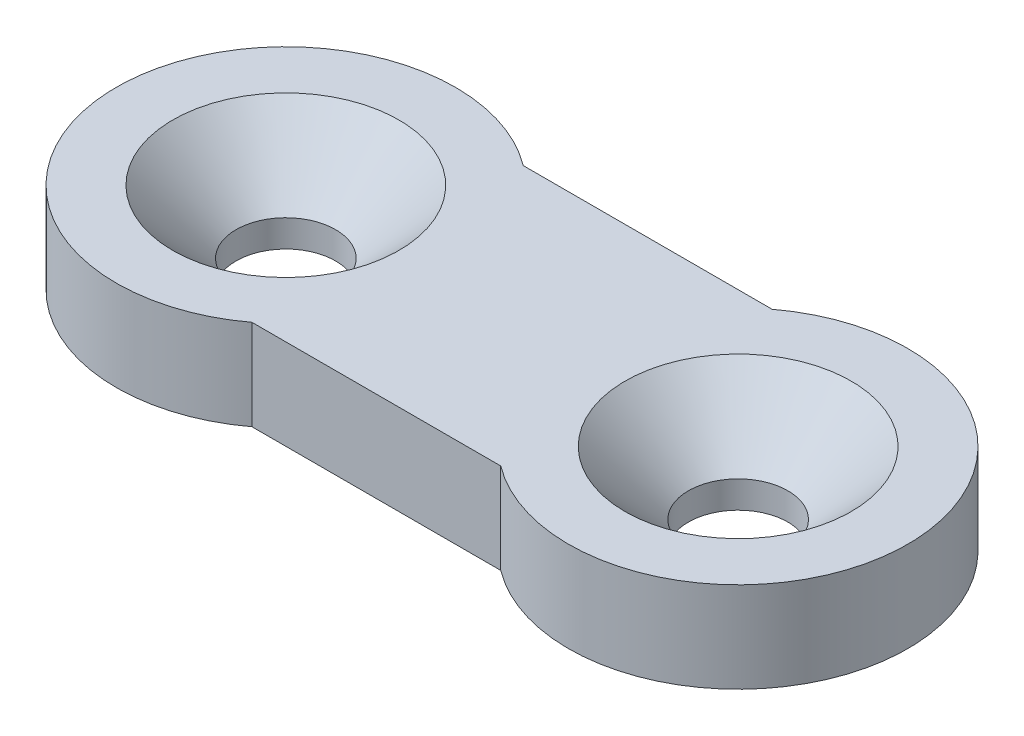
ISO-10303-21;
HEADER;
FILE_DESCRIPTION(('STEP AP214'),'2;1');
FILE_NAME('part.step','',(''),(''),'','','');
FILE_SCHEMA(('AUTOMOTIVE_DESIGN { 1 0 10303 214 1 1 1 1 }'));
ENDSEC;
DATA;
#1=APPLICATION_CONTEXT('core data for automotive mechanical design processes');
#2=APPLICATION_PROTOCOL_DEFINITION('international standard','automotive_design',2000,#1);
#3=PRODUCT_CONTEXT('',#1,'mechanical');
#4=PRODUCT('Part','Part','',(#3));
#5=PRODUCT_RELATED_PRODUCT_CATEGORY('part','',(#4));
#6=PRODUCT_DEFINITION_FORMATION('','',#4);
#7=PRODUCT_DEFINITION_CONTEXT('part definition',#1,'design');
#8=PRODUCT_DEFINITION('design','',#6,#7);
#9=PRODUCT_DEFINITION_SHAPE('','',#8);
#10=(LENGTH_UNIT() NAMED_UNIT(*) SI_UNIT(.MILLI.,.METRE.));
#11=(NAMED_UNIT(*) PLANE_ANGLE_UNIT() SI_UNIT($,.RADIAN.));
#12=(NAMED_UNIT(*) SI_UNIT($,.STERADIAN.) SOLID_ANGLE_UNIT());
#13=UNCERTAINTY_MEASURE_WITH_UNIT(LENGTH_MEASURE(1.E-05),#10,'distance_accuracy_value','');
#14=(GEOMETRIC_REPRESENTATION_CONTEXT(3) GLOBAL_UNCERTAINTY_ASSIGNED_CONTEXT((#13)) GLOBAL_UNIT_ASSIGNED_CONTEXT((#10,
#11,#12)) REPRESENTATION_CONTEXT('',''));
#15=CARTESIAN_POINT('',(0.,0.,0.));
#16=DIRECTION('',(0.,0.,1.));
#17=DIRECTION('',(1.,0.,0.));
#18=AXIS2_PLACEMENT_3D('',#15,#16,#17);
#19=CARTESIAN_POINT('',(-5.,2.,0.));
#20=DIRECTION('',(0.,1.,0.));
#21=DIRECTION('',(0.,0.,1.));
#22=AXIS2_PLACEMENT_3D('',#19,#20,#21);
#23=PLANE('',#22);
#24=CARTESIAN_POINT('',(5.,2.,0.));
#25=DIRECTION('',(0.,1.,0.));
#26=DIRECTION('',(0.,0.,1.));
#27=AXIS2_PLACEMENT_3D('',#24,#25,#26);
#28=CIRCLE('',#27,2.50000000000001);
#29=CARTESIAN_POINT('',(5.,2.,2.50000000000001));
#30=VERTEX_POINT('',#29);
#31=EDGE_CURVE('E57',#30,#30,#28,.F.);
#32=ORIENTED_EDGE('',*,*,#31,.T.);
#33=EDGE_LOOP('',(#32));
#34=FACE_BOUND('',#33,.T.);
#35=CARTESIAN_POINT('',(-5.,2.,0.));
#36=DIRECTION('',(0.,1.,0.));
#37=DIRECTION('',(0.,0.,1.));
#38=AXIS2_PLACEMENT_3D('',#35,#36,#37);
#39=CIRCLE('',#38,2.50000000000001);
#40=CARTESIAN_POINT('',(-5.,2.,2.50000000000001));
#41=VERTEX_POINT('',#40);
#42=EDGE_CURVE('E150',#41,#41,#39,.F.);
#43=ORIENTED_EDGE('',*,*,#42,.T.);
#44=EDGE_LOOP('',(#43));
#45=FACE_BOUND('',#44,.T.);
#46=DIRECTION('',(1.,0.,0.));
#47=VECTOR('',#46,1.);
#48=CARTESIAN_POINT('',(-5.,2.,3.));
#49=LINE('',#48,#47);
#50=CARTESIAN_POINT('',(-2.75,2.,3.));
#51=VERTEX_POINT('',#50);
#52=CARTESIAN_POINT('',(2.75,2.,3.));
#53=VERTEX_POINT('',#52);
#54=EDGE_CURVE('E100',#51,#53,#49,.T.);
#55=ORIENTED_EDGE('',*,*,#54,.T.);
#56=CARTESIAN_POINT('',(5.,2.,0.));
#57=DIRECTION('',(0.,1.,0.));
#58=DIRECTION('',(0.,0.,1.));
#59=AXIS2_PLACEMENT_3D('',#56,#57,#58);
#60=CIRCLE('',#59,3.75);
#61=CARTESIAN_POINT('',(2.75,2.,-3.));
#62=VERTEX_POINT('',#61);
#63=EDGE_CURVE('E115',#53,#62,#60,.T.);
#64=ORIENTED_EDGE('',*,*,#63,.T.);
#65=DIRECTION('',(-1.,0.,0.));
#66=VECTOR('',#65,1.);
#67=CARTESIAN_POINT('',(-5.,2.,-3.));
#68=LINE('',#67,#66);
#69=CARTESIAN_POINT('',(-2.75,2.,-3.));
#70=VERTEX_POINT('',#69);
#71=EDGE_CURVE('E105',#62,#70,#68,.T.);
#72=ORIENTED_EDGE('',*,*,#71,.T.);
#73=CARTESIAN_POINT('',(-5.,2.,0.));
#74=DIRECTION('',(0.,1.,0.));
#75=DIRECTION('',(0.,0.,1.));
#76=AXIS2_PLACEMENT_3D('',#73,#74,#75);
#77=CIRCLE('',#76,3.75);
#78=EDGE_CURVE('E119',#70,#51,#77,.T.);
#79=ORIENTED_EDGE('',*,*,#78,.T.);
#80=EDGE_LOOP('',(#55,#64,#72,#79));
#81=FACE_BOUND('',#80,.T.);
#82=ADVANCED_FACE('F47',(#34,#45,#81),#23,.T.);
#83=CARTESIAN_POINT('',(-5.,0.,0.));
#84=DIRECTION('',(0.,1.,0.));
#85=DIRECTION('',(0.,0.,1.));
#86=AXIS2_PLACEMENT_3D('',#83,#84,#85);
#87=PLANE('',#86);
#88=DIRECTION('',(-1.,0.,0.));
#89=VECTOR('',#88,1.);
#90=CARTESIAN_POINT('',(-5.,0.,-3.));
#91=LINE('',#90,#89);
#92=CARTESIAN_POINT('',(2.75,0.,-3.));
#93=VERTEX_POINT('',#92);
#94=CARTESIAN_POINT('',(-2.75,0.,-3.));
#95=VERTEX_POINT('',#94);
#96=EDGE_CURVE('E88',#93,#95,#91,.T.);
#97=ORIENTED_EDGE('',*,*,#96,.F.);
#98=CARTESIAN_POINT('',(5.,0.,0.));
#99=DIRECTION('',(0.,1.,0.));
#100=DIRECTION('',(0.,0.,1.));
#101=AXIS2_PLACEMENT_3D('',#98,#99,#100);
#102=CIRCLE('',#101,3.75);
#103=CARTESIAN_POINT('',(2.75,0.,3.));
#104=VERTEX_POINT('',#103);
#105=EDGE_CURVE('E93',#93,#104,#102,.F.);
#106=ORIENTED_EDGE('',*,*,#105,.T.);
#107=DIRECTION('',(1.,0.,0.));
#108=VECTOR('',#107,1.);
#109=CARTESIAN_POINT('',(-5.,0.,3.));
#110=LINE('',#109,#108);
#111=CARTESIAN_POINT('',(-2.75,0.,3.));
#112=VERTEX_POINT('',#111);
#113=EDGE_CURVE('E64',#112,#104,#110,.T.);
#114=ORIENTED_EDGE('',*,*,#113,.F.);
#115=CARTESIAN_POINT('',(-5.,0.,0.));
#116=DIRECTION('',(0.,1.,0.));
#117=DIRECTION('',(0.,0.,1.));
#118=AXIS2_PLACEMENT_3D('',#115,#116,#117);
#119=CIRCLE('',#118,3.75);
#120=EDGE_CURVE('E95',#112,#95,#119,.F.);
#121=ORIENTED_EDGE('',*,*,#120,.T.);
#122=EDGE_LOOP('',(#97,#106,#114,#121));
#123=FACE_BOUND('',#122,.T.);
#124=CARTESIAN_POINT('',(-5.,0.,0.));
#125=DIRECTION('',(0.,1.,0.));
#126=DIRECTION('',(0.,0.,1.));
#127=AXIS2_PLACEMENT_3D('',#124,#125,#126);
#128=CIRCLE('',#127,1.1);
#129=CARTESIAN_POINT('',(-5.,0.,1.1));
#130=VERTEX_POINT('',#129);
#131=EDGE_CURVE('E135',#130,#130,#128,.T.);
#132=ORIENTED_EDGE('',*,*,#131,.T.);
#133=EDGE_LOOP('',(#132));
#134=FACE_BOUND('',#133,.T.);
#135=CARTESIAN_POINT('',(5.,0.,0.));
#136=DIRECTION('',(0.,1.,0.));
#137=DIRECTION('',(0.,0.,1.));
#138=AXIS2_PLACEMENT_3D('',#135,#136,#137);
#139=CIRCLE('',#138,1.1);
#140=CARTESIAN_POINT('',(5.,0.,1.1));
#141=VERTEX_POINT('',#140);
#142=EDGE_CURVE('E131',#141,#141,#139,.T.);
#143=ORIENTED_EDGE('',*,*,#142,.T.);
#144=EDGE_LOOP('',(#143));
#145=FACE_BOUND('',#144,.T.);
#146=ADVANCED_FACE('F90',(#123,#134,#145),#87,.F.);
#147=CARTESIAN_POINT('',(-5.,2.,3.));
#148=DIRECTION('',(0.,0.,-1.));
#149=DIRECTION('',(-1.,0.,0.));
#150=AXIS2_PLACEMENT_3D('',#147,#148,#149);
#151=PLANE('',#150);
#152=ORIENTED_EDGE('',*,*,#113,.T.);
#153=DIRECTION('',(0.,1.,0.));
#154=VECTOR('',#153,1.);
#155=CARTESIAN_POINT('',(2.75,-10.6066017177982,3.));
#156=LINE('',#155,#154);
#157=EDGE_CURVE('E68',#104,#53,#156,.T.);
#158=ORIENTED_EDGE('',*,*,#157,.T.);
#159=ORIENTED_EDGE('',*,*,#54,.F.);
#160=DIRECTION('',(0.,1.,0.));
#161=VECTOR('',#160,1.);
#162=CARTESIAN_POINT('',(-2.75,-10.6066017177982,3.));
#163=LINE('',#162,#161);
#164=EDGE_CURVE('E125',#51,#112,#163,.F.);
#165=ORIENTED_EDGE('',*,*,#164,.T.);
#166=EDGE_LOOP('',(#152,#158,#159,#165));
#167=FACE_BOUND('',#166,.T.);
#168=ADVANCED_FACE('F173',(#167),#151,.F.);
#169=CARTESIAN_POINT('',(-5.,2.,-3.));
#170=DIRECTION('',(0.,0.,1.));
#171=DIRECTION('',(1.,0.,0.));
#172=AXIS2_PLACEMENT_3D('',#169,#170,#171);
#173=PLANE('',#172);
#174=ORIENTED_EDGE('',*,*,#71,.F.);
#175=DIRECTION('',(0.,1.,0.));
#176=VECTOR('',#175,1.);
#177=CARTESIAN_POINT('',(2.75,-10.6066017177982,-3.));
#178=LINE('',#177,#176);
#179=EDGE_CURVE('E103',#62,#93,#178,.F.);
#180=ORIENTED_EDGE('',*,*,#179,.T.);
#181=ORIENTED_EDGE('',*,*,#96,.T.);
#182=DIRECTION('',(0.,1.,0.));
#183=VECTOR('',#182,1.);
#184=CARTESIAN_POINT('',(-2.75,-10.6066017177982,-3.));
#185=LINE('',#184,#183);
#186=EDGE_CURVE('E111',#95,#70,#185,.T.);
#187=ORIENTED_EDGE('',*,*,#186,.T.);
#188=EDGE_LOOP('',(#174,#180,#181,#187));
#189=FACE_BOUND('',#188,.T.);
#190=ADVANCED_FACE('F104',(#189),#173,.F.);
#191=CARTESIAN_POINT('',(-5.,2.,0.));
#192=DIRECTION('',(0.,-1.,0.));
#193=DIRECTION('',(0.,0.,-1.));
#194=AXIS2_PLACEMENT_3D('',#191,#192,#193);
#195=CYLINDRICAL_SURFACE('',#194,1.1);
#196=CARTESIAN_POINT('',(-5.,0.599999999999997,0.));
#197=DIRECTION('',(0.,1.,0.));
#198=DIRECTION('',(0.,0.,1.));
#199=AXIS2_PLACEMENT_3D('',#196,#197,#198);
#200=CIRCLE('',#199,1.1);
#201=CARTESIAN_POINT('',(-5.,0.599999999999997,1.1));
#202=VERTEX_POINT('',#201);
#203=EDGE_CURVE('E11',#202,#202,#200,.T.);
#204=ORIENTED_EDGE('',*,*,#203,.T.);
#205=EDGE_LOOP('',(#204));
#206=FACE_BOUND('',#205,.T.);
#207=ORIENTED_EDGE('',*,*,#131,.F.);
#208=EDGE_LOOP('',(#207));
#209=FACE_BOUND('',#208,.T.);
#210=ADVANCED_FACE('F168',(#206,#209),#195,.F.);
#211=CARTESIAN_POINT('',(5.,2.,0.));
#212=DIRECTION('',(0.,-1.,0.));
#213=DIRECTION('',(0.,0.,-1.));
#214=AXIS2_PLACEMENT_3D('',#211,#212,#213);
#215=CYLINDRICAL_SURFACE('',#214,1.1);
#216=CARTESIAN_POINT('',(5.,0.599999999999997,0.));
#217=DIRECTION('',(0.,1.,0.));
#218=DIRECTION('',(0.,0.,1.));
#219=AXIS2_PLACEMENT_3D('',#216,#217,#218);
#220=CIRCLE('',#219,1.1);
#221=CARTESIAN_POINT('',(5.,0.599999999999997,1.1));
#222=VERTEX_POINT('',#221);
#223=EDGE_CURVE('E110',#222,#222,#220,.T.);
#224=ORIENTED_EDGE('',*,*,#223,.T.);
#225=EDGE_LOOP('',(#224));
#226=FACE_BOUND('',#225,.T.);
#227=ORIENTED_EDGE('',*,*,#142,.F.);
#228=EDGE_LOOP('',(#227));
#229=FACE_BOUND('',#228,.T.);
#230=ADVANCED_FACE('F164',(#226,#229),#215,.F.);
#231=CARTESIAN_POINT('',(-5.,-10.6066017177982,0.));
#232=DIRECTION('',(0.,1.,0.));
#233=DIRECTION('',(0.,0.,1.));
#234=AXIS2_PLACEMENT_3D('',#231,#232,#233);
#235=CYLINDRICAL_SURFACE('',#234,3.75);
#236=ORIENTED_EDGE('',*,*,#164,.F.);
#237=ORIENTED_EDGE('',*,*,#78,.F.);
#238=ORIENTED_EDGE('',*,*,#186,.F.);
#239=ORIENTED_EDGE('',*,*,#120,.F.);
#240=EDGE_LOOP('',(#236,#237,#238,#239));
#241=FACE_BOUND('',#240,.T.);
#242=ADVANCED_FACE('F167',(#241),#235,.T.);
#243=CARTESIAN_POINT('',(5.,-10.6066017177982,0.));
#244=DIRECTION('',(0.,1.,0.));
#245=DIRECTION('',(0.,0.,1.));
#246=AXIS2_PLACEMENT_3D('',#243,#244,#245);
#247=CYLINDRICAL_SURFACE('',#246,3.75);
#248=ORIENTED_EDGE('',*,*,#157,.F.);
#249=ORIENTED_EDGE('',*,*,#105,.F.);
#250=ORIENTED_EDGE('',*,*,#179,.F.);
#251=ORIENTED_EDGE('',*,*,#63,.F.);
#252=EDGE_LOOP('',(#248,#249,#250,#251));
#253=FACE_BOUND('',#252,.T.);
#254=ADVANCED_FACE('F113',(#253),#247,.T.);
#255=CARTESIAN_POINT('',(5.,0.599999999999997,0.));
#256=DIRECTION('',(0.,1.,0.));
#257=DIRECTION('',(0.,0.,1.));
#258=AXIS2_PLACEMENT_3D('',#255,#256,#257);
#259=CONICAL_SURFACE('',#258,1.1,0.78539816339745);
#260=ORIENTED_EDGE('',*,*,#31,.F.);
#261=EDGE_LOOP('',(#260));
#262=FACE_BOUND('',#261,.T.);
#263=ORIENTED_EDGE('',*,*,#223,.F.);
#264=EDGE_LOOP('',(#263));
#265=FACE_BOUND('',#264,.T.);
#266=ADVANCED_FACE('F159',(#262,#265),#259,.F.);
#267=CARTESIAN_POINT('',(-5.,0.599999999999997,0.));
#268=DIRECTION('',(0.,1.,0.));
#269=DIRECTION('',(0.,0.,1.));
#270=AXIS2_PLACEMENT_3D('',#267,#268,#269);
#271=CONICAL_SURFACE('',#270,1.1,0.78539816339745);
#272=ORIENTED_EDGE('',*,*,#42,.F.);
#273=EDGE_LOOP('',(#272));
#274=FACE_BOUND('',#273,.T.);
#275=ORIENTED_EDGE('',*,*,#203,.F.);
#276=EDGE_LOOP('',(#275));
#277=FACE_BOUND('',#276,.T.);
#278=ADVANCED_FACE('F50',(#274,#277),#271,.F.);
#279=CLOSED_SHELL('',(#82,#146,#168,#190,#210,#230,#242,#254,#266,#278));
#280=MANIFOLD_SOLID_BREP('B2',#279);
#281=ADVANCED_BREP_SHAPE_REPRESENTATION('',(#18,#280),#14);
#282=SHAPE_DEFINITION_REPRESENTATION(#9,#281);
ENDSEC;
END-ISO-10303-21;
